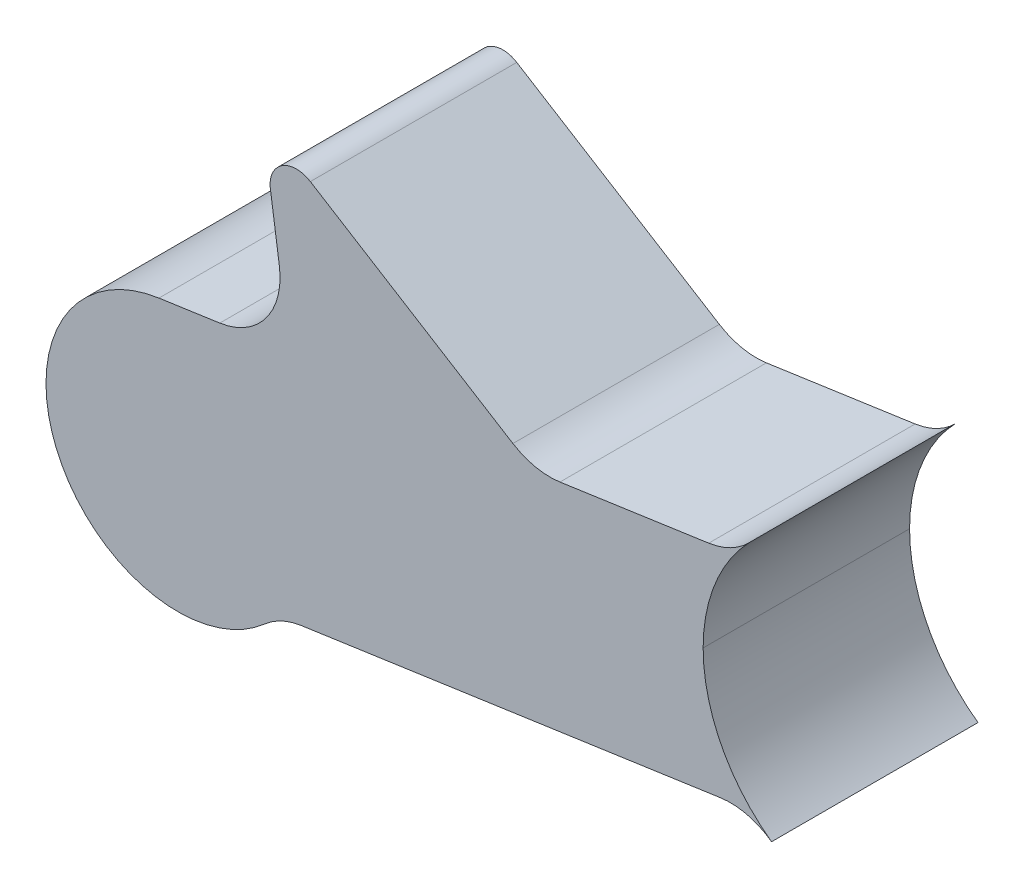
ISO-10303-21;
HEADER;
FILE_DESCRIPTION(('STEP AP214'),'2;1');
FILE_NAME('part.step','',(''),(''),'','','');
FILE_SCHEMA(('AUTOMOTIVE_DESIGN { 1 0 10303 214 1 1 1 1 }'));
ENDSEC;
DATA;
#1=APPLICATION_CONTEXT('core data for automotive mechanical design processes');
#2=APPLICATION_PROTOCOL_DEFINITION('international standard','automotive_design',2000,#1);
#3=PRODUCT_CONTEXT('',#1,'mechanical');
#4=PRODUCT('Part','Part','',(#3));
#5=PRODUCT_RELATED_PRODUCT_CATEGORY('part','',(#4));
#6=PRODUCT_DEFINITION_FORMATION('','',#4);
#7=PRODUCT_DEFINITION_CONTEXT('part definition',#1,'design');
#8=PRODUCT_DEFINITION('design','',#6,#7);
#9=PRODUCT_DEFINITION_SHAPE('','',#8);
#10=(LENGTH_UNIT() NAMED_UNIT(*) SI_UNIT(.MILLI.,.METRE.));
#11=(NAMED_UNIT(*) PLANE_ANGLE_UNIT() SI_UNIT($,.RADIAN.));
#12=(NAMED_UNIT(*) SI_UNIT($,.STERADIAN.) SOLID_ANGLE_UNIT());
#13=UNCERTAINTY_MEASURE_WITH_UNIT(LENGTH_MEASURE(1.E-05),#10,'distance_accuracy_value','');
#14=(GEOMETRIC_REPRESENTATION_CONTEXT(3) GLOBAL_UNCERTAINTY_ASSIGNED_CONTEXT((#13)) GLOBAL_UNIT_ASSIGNED_CONTEXT((#10,
#11,#12)) REPRESENTATION_CONTEXT('',''));
#15=CARTESIAN_POINT('',(0.,0.,0.));
#16=DIRECTION('',(0.,0.,1.));
#17=DIRECTION('',(1.,0.,0.));
#18=AXIS2_PLACEMENT_3D('',#15,#16,#17);
#19=CARTESIAN_POINT('',(30.6011444259713,54.9045162696453,4.7));
#20=DIRECTION('',(0.,0.,-1.));
#21=DIRECTION('',(0.,-1.,0.));
#22=AXIS2_PLACEMENT_3D('',#19,#20,#21);
#23=PLANE('',#22);
#24=CARTESIAN_POINT('',(-36.8555737068738,46.2228047811088,4.7));
#25=DIRECTION('',(0.,0.,-1.));
#26=DIRECTION('',(1.,0.,0.));
#27=AXIS2_PLACEMENT_3D('',#24,#25,#26);
#28=CIRCLE('',#27,3.19999999999991);
#29=CARTESIAN_POINT('',(-37.3123653382945,49.3900340758495,4.7));
#30=VERTEX_POINT('',#29);
#31=CARTESIAN_POINT('',(-34.9850901835967,48.8192044786031,4.7));
#32=VERTEX_POINT('',#31);
#33=EDGE_CURVE('E38',#30,#32,#28,.T.);
#34=ORIENTED_EDGE('',*,*,#33,.T.);
#35=CARTESIAN_POINT('',(-30.6011444259716,54.9045162696453,4.7));
#36=DIRECTION('',(0.,0.,-1.));
#37=DIRECTION('',(1.,0.,0.));
#38=AXIS2_PLACEMENT_3D('',#35,#36,#37);
#39=CIRCLE('',#38,7.49999999999992);
#40=CARTESIAN_POINT('',(-38.1011444259714,54.9045162696453,4.7));
#41=VERTEX_POINT('',#40);
#42=EDGE_CURVE('E183',#32,#41,#39,.T.);
#43=ORIENTED_EDGE('',*,*,#42,.T.);
#44=CARTESIAN_POINT('',(-30.6011444259716,54.9045162696453,4.7));
#45=DIRECTION('',(0.,0.,-1.));
#46=DIRECTION('',(1.,0.,0.));
#47=AXIS2_PLACEMENT_3D('',#44,#45,#46);
#48=CIRCLE('',#47,7.49999999999992);
#49=CARTESIAN_POINT('',(-36.00051382558,60.1099759118452,4.7));
#50=VERTEX_POINT('',#49);
#51=EDGE_CURVE('E11',#41,#50,#48,.T.);
#52=ORIENTED_EDGE('',*,*,#51,.T.);
#53=CARTESIAN_POINT('',(-38.3042447694158,62.3309720258474,4.7));
#54=DIRECTION('',(0.,0.,-1.));
#55=DIRECTION('',(1.,0.,0.));
#56=AXIS2_PLACEMENT_3D('',#53,#54,#55);
#57=CIRCLE('',#56,3.2);
#58=CARTESIAN_POINT('',(-37.847453137995,59.1637427311067,4.7));
#59=VERTEX_POINT('',#58);
#60=EDGE_CURVE('E215',#50,#59,#57,.T.);
#61=ORIENTED_EDGE('',*,*,#60,.T.);
#62=DIRECTION('',(-0.989759154606485,-0.142747384818972,0.));
#63=VECTOR('',#62,1.);
#64=CARTESIAN_POINT('',(-44.6212712762845,58.1867931166678,4.7));
#65=LINE('',#64,#63);
#66=CARTESIAN_POINT('',(-44.6212712762845,58.1867931166678,4.7));
#67=VERTEX_POINT('',#66);
#68=EDGE_CURVE('E277',#59,#67,#65,.T.);
#69=ORIENTED_EDGE('',*,*,#68,.T.);
#70=CARTESIAN_POINT('',(-45.0780629077053,61.3540224114086,4.7));
#71=DIRECTION('',(0.,0.,-1.));
#72=DIRECTION('',(1.,0.,0.));
#73=AXIS2_PLACEMENT_3D('',#70,#71,#72);
#74=CIRCLE('',#73,3.19999999999996);
#75=CARTESIAN_POINT('',(-46.7639959644878,58.6341640092031,4.7));
#76=VERTEX_POINT('',#75);
#77=EDGE_CURVE('E286',#67,#76,#74,.T.);
#78=ORIENTED_EDGE('',*,*,#77,.T.);
#79=DIRECTION('',(-0.849955750689228,0.526854080244531,0.));
#80=VECTOR('',#79,1.);
#81=CARTESIAN_POINT('',(-55.9883901017896,64.3520024791238,4.7));
#82=LINE('',#81,#80);
#83=CARTESIAN_POINT('',(-55.9883901017896,64.3520024791238,4.7));
#84=VERTEX_POINT('',#83);
#85=EDGE_CURVE('E302',#76,#84,#82,.T.);
#86=ORIENTED_EDGE('',*,*,#85,.T.);
#87=CARTESIAN_POINT('',(-56.6206149980831,63.3320555782967,4.7));
#88=DIRECTION('',(0.,0.,1.));
#89=DIRECTION('',(1.,0.,0.));
#90=AXIS2_PLACEMENT_3D('',#87,#88,#89);
#91=CIRCLE('',#90,1.20000000000001);
#92=CARTESIAN_POINT('',(-57.8206149980831,63.3320555782967,4.7));
#93=VERTEX_POINT('',#92);
#94=EDGE_CURVE('E229',#84,#93,#91,.T.);
#95=ORIENTED_EDGE('',*,*,#94,.T.);
#96=CARTESIAN_POINT('',(-56.6206149980831,63.3320555782967,4.7));
#97=DIRECTION('',(0.,0.,1.));
#98=DIRECTION('',(1.,0.,0.));
#99=AXIS2_PLACEMENT_3D('',#96,#97,#98);
#100=CIRCLE('',#99,1.20000000000001);
#101=CARTESIAN_POINT('',(-57.8083259836109,63.1607587165139,4.7));
#102=VERTEX_POINT('',#101);
#103=EDGE_CURVE('E202',#93,#102,#100,.T.);
#104=ORIENTED_EDGE('',*,*,#103,.T.);
#105=DIRECTION('',(0.142747384818987,-0.989759154606483,0.));
#106=VECTOR('',#105,1.);
#107=CARTESIAN_POINT('',(-57.4007185974163,60.3345553329433,4.7));
#108=LINE('',#107,#106);
#109=CARTESIAN_POINT('',(-57.4007185974163,60.3345553329433,4.7));
#110=VERTEX_POINT('',#109);
#111=EDGE_CURVE('E209',#102,#110,#108,.T.);
#112=ORIENTED_EDGE('',*,*,#111,.T.);
#113=CARTESIAN_POINT('',(-60.5679478921571,59.8777637015226,4.7));
#114=DIRECTION('',(0.,0.,-1.));
#115=DIRECTION('',(1.,0.,0.));
#116=AXIS2_PLACEMENT_3D('',#113,#114,#115);
#117=CIRCLE('',#116,3.2);
#118=CARTESIAN_POINT('',(-60.1111562607363,56.7105344067818,4.7));
#119=VERTEX_POINT('',#118);
#120=EDGE_CURVE('E313',#110,#119,#117,.T.);
#121=ORIENTED_EDGE('',*,*,#120,.T.);
#122=DIRECTION('',(-0.989759154606485,-0.142747384818971,0.));
#123=VECTOR('',#122,1.);
#124=CARTESIAN_POINT('',(-62.8824818936345,56.3108417292887,4.7));
#125=LINE('',#124,#123);
#126=CARTESIAN_POINT('',(-62.8824818936345,56.3108417292887,4.7));
#127=VERTEX_POINT('',#126);
#128=EDGE_CURVE('E299',#119,#127,#125,.T.);
#129=ORIENTED_EDGE('',*,*,#128,.T.);
#130=CARTESIAN_POINT('',(-62.0259975845988,50.3722868016673,4.7));
#131=DIRECTION('',(0.,0.,1.));
#132=DIRECTION('',(1.,0.,0.));
#133=AXIS2_PLACEMENT_3D('',#130,#131,#132);
#134=CIRCLE('',#133,6.);
#135=CARTESIAN_POINT('',(-68.0259975845988,50.3722868016673,4.7));
#136=VERTEX_POINT('',#135);
#137=EDGE_CURVE('E221',#127,#136,#134,.T.);
#138=ORIENTED_EDGE('',*,*,#137,.T.);
#139=CARTESIAN_POINT('',(-62.0259975845988,50.3722868016673,4.7));
#140=DIRECTION('',(0.,0.,1.));
#141=DIRECTION('',(1.,0.,0.));
#142=AXIS2_PLACEMENT_3D('',#139,#140,#141);
#143=CIRCLE('',#142,6.);
#144=CARTESIAN_POINT('',(-58.0591681483125,45.8707021669622,4.7));
#145=VERTEX_POINT('',#144);
#146=EDGE_CURVE('E337',#136,#145,#143,.T.);
#147=ORIENTED_EDGE('',*,*,#146,.T.);
#148=CARTESIAN_POINT('',(-55.9435257822543,43.4698570284872,4.7));
#149=DIRECTION('',(0.,0.,-1.));
#150=DIRECTION('',(1.,0.,0.));
#151=AXIS2_PLACEMENT_3D('',#148,#149,#150);
#152=CIRCLE('',#151,3.19999999999993);
#153=CARTESIAN_POINT('',(-56.400317413675,46.6370863232279,4.7));
#154=VERTEX_POINT('',#153);
#155=EDGE_CURVE('E251',#145,#154,#152,.T.);
#156=ORIENTED_EDGE('',*,*,#155,.T.);
#157=DIRECTION('',(0.989759154606484,0.142747384818981,0.));
#158=VECTOR('',#157,1.);
#159=CARTESIAN_POINT('',(-37.3123653382945,49.3900340758495,4.7));
#160=LINE('',#159,#158);
#161=EDGE_CURVE('E175',#154,#30,#160,.T.);
#162=ORIENTED_EDGE('',*,*,#161,.T.);
#163=EDGE_LOOP('',(#34,#43,#52,#61,#69,#78,#86,#95,#104,#112,#121,#129,#138,#147,#156,#162));
#164=FACE_BOUND('',#163,.T.);
#165=ADVANCED_FACE('F17',(#164),#23,.F.);
#166=CARTESIAN_POINT('',(-31.4999999996571,43.1601366996606,-4.7));
#167=DIRECTION('',(0.,0.,1.));
#168=DIRECTION('',(0.,-1.,0.));
#169=AXIS2_PLACEMENT_3D('',#166,#167,#168);
#170=PLANE('',#169);
#171=CARTESIAN_POINT('',(-38.3042447694158,62.3309720258474,-4.7));
#172=DIRECTION('',(0.,0.,-1.));
#173=DIRECTION('',(0.,-1.,0.));
#174=AXIS2_PLACEMENT_3D('',#171,#172,#173);
#175=CIRCLE('',#174,3.2);
#176=CARTESIAN_POINT('',(-36.00051382558,60.1099759118452,-4.7));
#177=VERTEX_POINT('',#176);
#178=CARTESIAN_POINT('',(-37.847453137995,59.1637427311067,-4.7));
#179=VERTEX_POINT('',#178);
#180=EDGE_CURVE('E228',#177,#179,#175,.T.);
#181=ORIENTED_EDGE('',*,*,#180,.F.);
#182=CARTESIAN_POINT('',(-30.6011444259716,54.9045162696453,-4.7));
#183=DIRECTION('',(0.,0.,-1.));
#184=DIRECTION('',(0.,-1.,0.));
#185=AXIS2_PLACEMENT_3D('',#182,#183,#184);
#186=CIRCLE('',#185,7.49999999999992);
#187=CARTESIAN_POINT('',(-38.1011444259714,54.9045162696453,-4.7));
#188=VERTEX_POINT('',#187);
#189=EDGE_CURVE('E25',#188,#177,#186,.T.);
#190=ORIENTED_EDGE('',*,*,#189,.F.);
#191=CARTESIAN_POINT('',(-30.6011444259716,54.9045162696453,-4.7));
#192=DIRECTION('',(0.,0.,-1.));
#193=DIRECTION('',(0.,-1.,0.));
#194=AXIS2_PLACEMENT_3D('',#191,#192,#193);
#195=CIRCLE('',#194,7.49999999999992);
#196=CARTESIAN_POINT('',(-34.9850901835967,48.8192044786031,-4.7));
#197=VERTEX_POINT('',#196);
#198=EDGE_CURVE('E181',#197,#188,#195,.T.);
#199=ORIENTED_EDGE('',*,*,#198,.F.);
#200=CARTESIAN_POINT('',(-36.8555737068738,46.2228047811088,-4.7));
#201=DIRECTION('',(0.,0.,-1.));
#202=DIRECTION('',(0.,-1.,0.));
#203=AXIS2_PLACEMENT_3D('',#200,#201,#202);
#204=CIRCLE('',#203,3.19999999999991);
#205=CARTESIAN_POINT('',(-37.3123653382945,49.3900340758495,-4.7));
#206=VERTEX_POINT('',#205);
#207=EDGE_CURVE('E49',#206,#197,#204,.T.);
#208=ORIENTED_EDGE('',*,*,#207,.F.);
#209=DIRECTION('',(0.989759154606484,0.142747384818981,0.));
#210=VECTOR('',#209,1.);
#211=CARTESIAN_POINT('',(-37.3123653382945,49.3900340758495,-4.7));
#212=LINE('',#211,#210);
#213=CARTESIAN_POINT('',(-56.400317413675,46.6370863232279,-4.7));
#214=VERTEX_POINT('',#213);
#215=EDGE_CURVE('E255',#214,#206,#212,.T.);
#216=ORIENTED_EDGE('',*,*,#215,.F.);
#217=CARTESIAN_POINT('',(-55.9435257822543,43.4698570284872,-4.7));
#218=DIRECTION('',(0.,0.,-1.));
#219=DIRECTION('',(0.,-1.,0.));
#220=AXIS2_PLACEMENT_3D('',#217,#218,#219);
#221=CIRCLE('',#220,3.19999999999993);
#222=CARTESIAN_POINT('',(-58.0591681483125,45.8707021669622,-4.7));
#223=VERTEX_POINT('',#222);
#224=EDGE_CURVE('E341',#223,#214,#221,.T.);
#225=ORIENTED_EDGE('',*,*,#224,.F.);
#226=CARTESIAN_POINT('',(-62.0259975845988,50.3722868016673,-4.7));
#227=DIRECTION('',(0.,0.,1.));
#228=DIRECTION('',(0.,-1.,0.));
#229=AXIS2_PLACEMENT_3D('',#226,#227,#228);
#230=CIRCLE('',#229,6.);
#231=CARTESIAN_POINT('',(-68.0259975845988,50.3722868016673,-4.7));
#232=VERTEX_POINT('',#231);
#233=EDGE_CURVE('E294',#232,#223,#230,.T.);
#234=ORIENTED_EDGE('',*,*,#233,.F.);
#235=CARTESIAN_POINT('',(-62.0259975845988,50.3722868016673,-4.7));
#236=DIRECTION('',(0.,0.,1.));
#237=DIRECTION('',(0.,-1.,0.));
#238=AXIS2_PLACEMENT_3D('',#235,#236,#237);
#239=CIRCLE('',#238,6.);
#240=CARTESIAN_POINT('',(-62.8824818936345,56.3108417292887,-4.7));
#241=VERTEX_POINT('',#240);
#242=EDGE_CURVE('E185',#241,#232,#239,.T.);
#243=ORIENTED_EDGE('',*,*,#242,.F.);
#244=DIRECTION('',(-0.989759154606485,-0.142747384818971,0.));
#245=VECTOR('',#244,1.);
#246=CARTESIAN_POINT('',(-62.8824818936345,56.3108417292887,-4.7));
#247=LINE('',#246,#245);
#248=CARTESIAN_POINT('',(-60.1111562607363,56.7105344067818,-4.7));
#249=VERTEX_POINT('',#248);
#250=EDGE_CURVE('E310',#249,#241,#247,.T.);
#251=ORIENTED_EDGE('',*,*,#250,.F.);
#252=CARTESIAN_POINT('',(-60.5679478921571,59.8777637015226,-4.7));
#253=DIRECTION('',(0.,0.,-1.));
#254=DIRECTION('',(0.,-1.,0.));
#255=AXIS2_PLACEMENT_3D('',#252,#253,#254);
#256=CIRCLE('',#255,3.2);
#257=CARTESIAN_POINT('',(-57.4007185974163,60.3345553329433,-4.7));
#258=VERTEX_POINT('',#257);
#259=EDGE_CURVE('E204',#258,#249,#256,.T.);
#260=ORIENTED_EDGE('',*,*,#259,.F.);
#261=DIRECTION('',(0.142747384818987,-0.989759154606483,0.));
#262=VECTOR('',#261,1.);
#263=CARTESIAN_POINT('',(-57.4007185974163,60.3345553329433,-4.7));
#264=LINE('',#263,#262);
#265=CARTESIAN_POINT('',(-57.8083259836109,63.1607587165139,-4.7));
#266=VERTEX_POINT('',#265);
#267=EDGE_CURVE('E199',#266,#258,#264,.T.);
#268=ORIENTED_EDGE('',*,*,#267,.F.);
#269=CARTESIAN_POINT('',(-56.6206149980831,63.3320555782967,-4.7));
#270=DIRECTION('',(0.,0.,1.));
#271=DIRECTION('',(0.,-1.,0.));
#272=AXIS2_PLACEMENT_3D('',#269,#270,#271);
#273=CIRCLE('',#272,1.20000000000001);
#274=CARTESIAN_POINT('',(-57.8206149980831,63.3320555782967,-4.7));
#275=VERTEX_POINT('',#274);
#276=EDGE_CURVE('E305',#275,#266,#273,.T.);
#277=ORIENTED_EDGE('',*,*,#276,.F.);
#278=CARTESIAN_POINT('',(-56.6206149980831,63.3320555782967,-4.7));
#279=DIRECTION('',(0.,0.,1.));
#280=DIRECTION('',(0.,-1.,0.));
#281=AXIS2_PLACEMENT_3D('',#278,#279,#280);
#282=CIRCLE('',#281,1.20000000000001);
#283=CARTESIAN_POINT('',(-55.9883901017896,64.3520024791238,-4.7));
#284=VERTEX_POINT('',#283);
#285=EDGE_CURVE('E220',#284,#275,#282,.T.);
#286=ORIENTED_EDGE('',*,*,#285,.F.);
#287=DIRECTION('',(-0.849955750689228,0.526854080244531,0.));
#288=VECTOR('',#287,1.);
#289=CARTESIAN_POINT('',(-55.9883901017896,64.3520024791238,-4.7));
#290=LINE('',#289,#288);
#291=CARTESIAN_POINT('',(-46.7639959644878,58.6341640092031,-4.7));
#292=VERTEX_POINT('',#291);
#293=EDGE_CURVE('E290',#292,#284,#290,.T.);
#294=ORIENTED_EDGE('',*,*,#293,.F.);
#295=CARTESIAN_POINT('',(-45.0780629077053,61.3540224114086,-4.7));
#296=DIRECTION('',(0.,0.,-1.));
#297=DIRECTION('',(0.,-1.,0.));
#298=AXIS2_PLACEMENT_3D('',#295,#296,#297);
#299=CIRCLE('',#298,3.19999999999996);
#300=CARTESIAN_POINT('',(-44.6212712762845,58.1867931166678,-4.7));
#301=VERTEX_POINT('',#300);
#302=EDGE_CURVE('E281',#301,#292,#299,.T.);
#303=ORIENTED_EDGE('',*,*,#302,.F.);
#304=DIRECTION('',(-0.989759154606485,-0.142747384818972,0.));
#305=VECTOR('',#304,1.);
#306=CARTESIAN_POINT('',(-44.6212712762845,58.1867931166678,-4.7));
#307=LINE('',#306,#305);
#308=EDGE_CURVE('E214',#179,#301,#307,.T.);
#309=ORIENTED_EDGE('',*,*,#308,.F.);
#310=EDGE_LOOP('',(#181,#190,#199,#208,#216,#225,#234,#243,#251,#260,#268,#277,#286,#294,#303,#309));
#311=FACE_BOUND('',#310,.T.);
#312=ADVANCED_FACE('F188',(#311),#170,.F.);
#313=CARTESIAN_POINT('',(-30.6011444259716,54.9045162696453,-43.405527241064));
#314=DIRECTION('',(0.,0.,1.));
#315=DIRECTION('',(-1.,0.,0.));
#316=AXIS2_PLACEMENT_3D('',#313,#314,#315);
#317=CYLINDRICAL_SURFACE('',#316,7.49999999999992);
#318=DIRECTION('',(0.,0.,1.));
#319=VECTOR('',#318,1.);
#320=CARTESIAN_POINT('',(-38.1011444259714,54.9045162696453,-43.405527241064));
#321=LINE('',#320,#319);
#322=EDGE_CURVE('E191',#188,#41,#321,.T.);
#323=ORIENTED_EDGE('',*,*,#322,.F.);
#324=ORIENTED_EDGE('',*,*,#189,.T.);
#325=DIRECTION('',(0.,0.,1.));
#326=VECTOR('',#325,1.);
#327=CARTESIAN_POINT('',(-36.00051382558,60.1099759118452,-43.405527241064));
#328=LINE('',#327,#326);
#329=EDGE_CURVE('E210',#177,#50,#328,.T.);
#330=ORIENTED_EDGE('',*,*,#329,.T.);
#331=ORIENTED_EDGE('',*,*,#51,.F.);
#332=EDGE_LOOP('',(#323,#324,#330,#331));
#333=FACE_BOUND('',#332,.T.);
#334=ADVANCED_FACE('F400',(#333),#317,.F.);
#335=CARTESIAN_POINT('',(-36.8555737068738,46.2228047811088,-43.405527241064));
#336=DIRECTION('',(0.,0.,1.));
#337=DIRECTION('',(-1.,0.,0.));
#338=AXIS2_PLACEMENT_3D('',#335,#336,#337);
#339=CYLINDRICAL_SURFACE('',#338,3.19999999999991);
#340=ORIENTED_EDGE('',*,*,#207,.T.);
#341=DIRECTION('',(0.,0.,1.));
#342=VECTOR('',#341,1.);
#343=CARTESIAN_POINT('',(-34.9850901835967,48.8192044786031,-43.405527241064));
#344=LINE('',#343,#342);
#345=EDGE_CURVE('E169',#197,#32,#344,.T.);
#346=ORIENTED_EDGE('',*,*,#345,.T.);
#347=ORIENTED_EDGE('',*,*,#33,.F.);
#348=DIRECTION('',(0.,0.,1.));
#349=VECTOR('',#348,1.);
#350=CARTESIAN_POINT('',(-37.3123653382945,49.3900340758495,-43.405527241064));
#351=LINE('',#350,#349);
#352=EDGE_CURVE('E172',#206,#30,#351,.T.);
#353=ORIENTED_EDGE('',*,*,#352,.F.);
#354=EDGE_LOOP('',(#340,#346,#347,#353));
#355=FACE_BOUND('',#354,.T.);
#356=ADVANCED_FACE('F168',(#355),#339,.F.);
#357=CARTESIAN_POINT('',(-37.3123653382945,49.3900340758495,-43.405527241064));
#358=DIRECTION('',(0.142747384818981,-0.989759154606484,0.));
#359=DIRECTION('',(0.,0.,-1.));
#360=AXIS2_PLACEMENT_3D('',#357,#358,#359);
#361=PLANE('',#360);
#362=ORIENTED_EDGE('',*,*,#215,.T.);
#363=ORIENTED_EDGE('',*,*,#352,.T.);
#364=ORIENTED_EDGE('',*,*,#161,.F.);
#365=DIRECTION('',(0.,0.,1.));
#366=VECTOR('',#365,1.);
#367=CARTESIAN_POINT('',(-56.400317413675,46.6370863232279,-43.405527241064));
#368=LINE('',#367,#366);
#369=EDGE_CURVE('E256',#214,#154,#368,.T.);
#370=ORIENTED_EDGE('',*,*,#369,.F.);
#371=EDGE_LOOP('',(#362,#363,#364,#370));
#372=FACE_BOUND('',#371,.T.);
#373=ADVANCED_FACE('F357',(#372),#361,.T.);
#374=CARTESIAN_POINT('',(-55.9435257822543,43.4698570284872,-43.405527241064));
#375=DIRECTION('',(0.,0.,1.));
#376=DIRECTION('',(-1.,0.,0.));
#377=AXIS2_PLACEMENT_3D('',#374,#375,#376);
#378=CYLINDRICAL_SURFACE('',#377,3.19999999999993);
#379=ORIENTED_EDGE('',*,*,#224,.T.);
#380=ORIENTED_EDGE('',*,*,#369,.T.);
#381=ORIENTED_EDGE('',*,*,#155,.F.);
#382=DIRECTION('',(0.,0.,1.));
#383=VECTOR('',#382,1.);
#384=CARTESIAN_POINT('',(-58.0591681483125,45.8707021669622,-43.405527241064));
#385=LINE('',#384,#383);
#386=EDGE_CURVE('E298',#223,#145,#385,.T.);
#387=ORIENTED_EDGE('',*,*,#386,.F.);
#388=EDGE_LOOP('',(#379,#380,#381,#387));
#389=FACE_BOUND('',#388,.T.);
#390=ADVANCED_FACE('F362',(#389),#378,.F.);
#391=CARTESIAN_POINT('',(-62.0259975845988,50.3722868016673,-43.405527241064));
#392=DIRECTION('',(0.,0.,1.));
#393=DIRECTION('',(-1.,0.,0.));
#394=AXIS2_PLACEMENT_3D('',#391,#392,#393);
#395=CYLINDRICAL_SURFACE('',#394,6.);
#396=DIRECTION('',(0.,0.,1.));
#397=VECTOR('',#396,1.);
#398=CARTESIAN_POINT('',(-68.0259975845988,50.3722868016673,-43.405527241064));
#399=LINE('',#398,#397);
#400=EDGE_CURVE('E236',#232,#136,#399,.T.);
#401=ORIENTED_EDGE('',*,*,#400,.F.);
#402=ORIENTED_EDGE('',*,*,#233,.T.);
#403=ORIENTED_EDGE('',*,*,#386,.T.);
#404=ORIENTED_EDGE('',*,*,#146,.F.);
#405=EDGE_LOOP('',(#401,#402,#403,#404));
#406=FACE_BOUND('',#405,.T.);
#407=ADVANCED_FACE('F364',(#406),#395,.T.);
#408=CARTESIAN_POINT('',(-62.8824818936345,56.3108417292887,-43.405527241064));
#409=DIRECTION('',(-0.142747384818971,0.989759154606485,0.));
#410=DIRECTION('',(0.,0.,1.));
#411=AXIS2_PLACEMENT_3D('',#408,#409,#410);
#412=PLANE('',#411);
#413=ORIENTED_EDGE('',*,*,#250,.T.);
#414=DIRECTION('',(0.,0.,1.));
#415=VECTOR('',#414,1.);
#416=CARTESIAN_POINT('',(-62.8824818936345,56.3108417292887,-43.405527241064));
#417=LINE('',#416,#415);
#418=EDGE_CURVE('E216',#241,#127,#417,.T.);
#419=ORIENTED_EDGE('',*,*,#418,.T.);
#420=ORIENTED_EDGE('',*,*,#128,.F.);
#421=DIRECTION('',(0.,0.,1.));
#422=VECTOR('',#421,1.);
#423=CARTESIAN_POINT('',(-60.1111562607363,56.7105344067818,-43.405527241064));
#424=LINE('',#423,#422);
#425=EDGE_CURVE('E208',#249,#119,#424,.T.);
#426=ORIENTED_EDGE('',*,*,#425,.F.);
#427=EDGE_LOOP('',(#413,#419,#420,#426));
#428=FACE_BOUND('',#427,.T.);
#429=ADVANCED_FACE('F372',(#428),#412,.T.);
#430=CARTESIAN_POINT('',(-60.5679478921571,59.8777637015226,-43.405527241064));
#431=DIRECTION('',(0.,0.,1.));
#432=DIRECTION('',(-1.,0.,0.));
#433=AXIS2_PLACEMENT_3D('',#430,#431,#432);
#434=CYLINDRICAL_SURFACE('',#433,3.2);
#435=ORIENTED_EDGE('',*,*,#259,.T.);
#436=ORIENTED_EDGE('',*,*,#425,.T.);
#437=ORIENTED_EDGE('',*,*,#120,.F.);
#438=DIRECTION('',(0.,0.,1.));
#439=VECTOR('',#438,1.);
#440=CARTESIAN_POINT('',(-57.4007185974163,60.3345553329433,-43.405527241064));
#441=LINE('',#440,#439);
#442=EDGE_CURVE('E201',#258,#110,#441,.T.);
#443=ORIENTED_EDGE('',*,*,#442,.F.);
#444=EDGE_LOOP('',(#435,#436,#437,#443));
#445=FACE_BOUND('',#444,.T.);
#446=ADVANCED_FACE('F374',(#445),#434,.F.);
#447=CARTESIAN_POINT('',(-57.4007185974163,60.3345553329433,-43.405527241064));
#448=DIRECTION('',(-0.989759154606483,-0.142747384818987,0.));
#449=DIRECTION('',(-0.142747384818987,0.989759154606483,0.));
#450=AXIS2_PLACEMENT_3D('',#447,#448,#449);
#451=PLANE('',#450);
#452=ORIENTED_EDGE('',*,*,#267,.T.);
#453=ORIENTED_EDGE('',*,*,#442,.T.);
#454=ORIENTED_EDGE('',*,*,#111,.F.);
#455=DIRECTION('',(0.,0.,1.));
#456=VECTOR('',#455,1.);
#457=CARTESIAN_POINT('',(-57.8083259836109,63.1607587165139,-43.405527241064));
#458=LINE('',#457,#456);
#459=EDGE_CURVE('E309',#266,#102,#458,.T.);
#460=ORIENTED_EDGE('',*,*,#459,.F.);
#461=EDGE_LOOP('',(#452,#453,#454,#460));
#462=FACE_BOUND('',#461,.T.);
#463=ADVANCED_FACE('F377',(#462),#451,.T.);
#464=CARTESIAN_POINT('',(-56.6206149980831,63.3320555782967,-43.405527241064));
#465=DIRECTION('',(0.,0.,1.));
#466=DIRECTION('',(-1.,0.,0.));
#467=AXIS2_PLACEMENT_3D('',#464,#465,#466);
#468=CYLINDRICAL_SURFACE('',#467,1.20000000000001);
#469=DIRECTION('',(0.,0.,1.));
#470=VECTOR('',#469,1.);
#471=CARTESIAN_POINT('',(-57.8206149980831,63.3320555782967,-43.405527241064));
#472=LINE('',#471,#470);
#473=EDGE_CURVE('E263',#275,#93,#472,.T.);
#474=ORIENTED_EDGE('',*,*,#473,.F.);
#475=ORIENTED_EDGE('',*,*,#276,.T.);
#476=ORIENTED_EDGE('',*,*,#459,.T.);
#477=ORIENTED_EDGE('',*,*,#103,.F.);
#478=EDGE_LOOP('',(#474,#475,#476,#477));
#479=FACE_BOUND('',#478,.T.);
#480=ADVANCED_FACE('F381',(#479),#468,.T.);
#481=CARTESIAN_POINT('',(-55.9883901017896,64.3520024791238,-43.405527241064));
#482=DIRECTION('',(0.526854080244531,0.849955750689228,0.));
#483=DIRECTION('',(0.,0.,-1.));
#484=AXIS2_PLACEMENT_3D('',#481,#482,#483);
#485=PLANE('',#484);
#486=ORIENTED_EDGE('',*,*,#293,.T.);
#487=DIRECTION('',(0.,0.,1.));
#488=VECTOR('',#487,1.);
#489=CARTESIAN_POINT('',(-55.9883901017896,64.3520024791238,-43.405527241064));
#490=LINE('',#489,#488);
#491=EDGE_CURVE('E224',#284,#84,#490,.T.);
#492=ORIENTED_EDGE('',*,*,#491,.T.);
#493=ORIENTED_EDGE('',*,*,#85,.F.);
#494=DIRECTION('',(0.,0.,1.));
#495=VECTOR('',#494,1.);
#496=CARTESIAN_POINT('',(-46.7639959644878,58.6341640092031,-43.405527241064));
#497=LINE('',#496,#495);
#498=EDGE_CURVE('E285',#292,#76,#497,.T.);
#499=ORIENTED_EDGE('',*,*,#498,.F.);
#500=EDGE_LOOP('',(#486,#492,#493,#499));
#501=FACE_BOUND('',#500,.T.);
#502=ADVANCED_FACE('F387',(#501),#485,.T.);
#503=CARTESIAN_POINT('',(-45.0780629077053,61.3540224114086,-43.405527241064));
#504=DIRECTION('',(0.,0.,1.));
#505=DIRECTION('',(-1.,0.,0.));
#506=AXIS2_PLACEMENT_3D('',#503,#504,#505);
#507=CYLINDRICAL_SURFACE('',#506,3.19999999999996);
#508=ORIENTED_EDGE('',*,*,#302,.T.);
#509=ORIENTED_EDGE('',*,*,#498,.T.);
#510=ORIENTED_EDGE('',*,*,#77,.F.);
#511=DIRECTION('',(0.,0.,1.));
#512=VECTOR('',#511,1.);
#513=CARTESIAN_POINT('',(-44.6212712762845,58.1867931166678,-43.405527241064));
#514=LINE('',#513,#512);
#515=EDGE_CURVE('E273',#301,#67,#514,.T.);
#516=ORIENTED_EDGE('',*,*,#515,.F.);
#517=EDGE_LOOP('',(#508,#509,#510,#516));
#518=FACE_BOUND('',#517,.T.);
#519=ADVANCED_FACE('F392',(#518),#507,.F.);
#520=CARTESIAN_POINT('',(-44.6212712762845,58.1867931166678,-43.405527241064));
#521=DIRECTION('',(-0.142747384818972,0.989759154606485,0.));
#522=DIRECTION('',(0.,0.,1.));
#523=AXIS2_PLACEMENT_3D('',#520,#521,#522);
#524=PLANE('',#523);
#525=ORIENTED_EDGE('',*,*,#308,.T.);
#526=ORIENTED_EDGE('',*,*,#515,.T.);
#527=ORIENTED_EDGE('',*,*,#68,.F.);
#528=DIRECTION('',(0.,0.,1.));
#529=VECTOR('',#528,1.);
#530=CARTESIAN_POINT('',(-37.847453137995,59.1637427311067,-43.405527241064));
#531=LINE('',#530,#529);
#532=EDGE_CURVE('E235',#179,#59,#531,.T.);
#533=ORIENTED_EDGE('',*,*,#532,.F.);
#534=EDGE_LOOP('',(#525,#526,#527,#533));
#535=FACE_BOUND('',#534,.T.);
#536=ADVANCED_FACE('F394',(#535),#524,.T.);
#537=CARTESIAN_POINT('',(-38.3042447694158,62.3309720258474,-43.405527241064));
#538=DIRECTION('',(0.,0.,1.));
#539=DIRECTION('',(-1.,0.,0.));
#540=AXIS2_PLACEMENT_3D('',#537,#538,#539);
#541=CYLINDRICAL_SURFACE('',#540,3.2);
#542=ORIENTED_EDGE('',*,*,#180,.T.);
#543=ORIENTED_EDGE('',*,*,#532,.T.);
#544=ORIENTED_EDGE('',*,*,#60,.F.);
#545=ORIENTED_EDGE('',*,*,#329,.F.);
#546=EDGE_LOOP('',(#542,#543,#544,#545));
#547=FACE_BOUND('',#546,.T.);
#548=ADVANCED_FACE('F398',(#547),#541,.F.);
#549=CARTESIAN_POINT('',(-56.6206149980831,63.3320555782967,-43.405527241064));
#550=DIRECTION('',(0.,0.,1.));
#551=DIRECTION('',(-1.,0.,0.));
#552=AXIS2_PLACEMENT_3D('',#549,#550,#551);
#553=CYLINDRICAL_SURFACE('',#552,1.20000000000001);
#554=ORIENTED_EDGE('',*,*,#285,.T.);
#555=ORIENTED_EDGE('',*,*,#473,.T.);
#556=ORIENTED_EDGE('',*,*,#94,.F.);
#557=ORIENTED_EDGE('',*,*,#491,.F.);
#558=EDGE_LOOP('',(#554,#555,#556,#557));
#559=FACE_BOUND('',#558,.T.);
#560=ADVANCED_FACE('F385',(#559),#553,.T.);
#561=CARTESIAN_POINT('',(-62.0259975845988,50.3722868016673,-43.405527241064));
#562=DIRECTION('',(0.,0.,1.));
#563=DIRECTION('',(-1.,0.,0.));
#564=AXIS2_PLACEMENT_3D('',#561,#562,#563);
#565=CYLINDRICAL_SURFACE('',#564,6.);
#566=ORIENTED_EDGE('',*,*,#242,.T.);
#567=ORIENTED_EDGE('',*,*,#400,.T.);
#568=ORIENTED_EDGE('',*,*,#137,.F.);
#569=ORIENTED_EDGE('',*,*,#418,.F.);
#570=EDGE_LOOP('',(#566,#567,#568,#569));
#571=FACE_BOUND('',#570,.T.);
#572=ADVANCED_FACE('F368',(#571),#565,.T.);
#573=CARTESIAN_POINT('',(-30.6011444259716,54.9045162696453,-43.405527241064));
#574=DIRECTION('',(0.,0.,1.));
#575=DIRECTION('',(-1.,0.,0.));
#576=AXIS2_PLACEMENT_3D('',#573,#574,#575);
#577=CYLINDRICAL_SURFACE('',#576,7.49999999999992);
#578=ORIENTED_EDGE('',*,*,#198,.T.);
#579=ORIENTED_EDGE('',*,*,#322,.T.);
#580=ORIENTED_EDGE('',*,*,#42,.F.);
#581=ORIENTED_EDGE('',*,*,#345,.F.);
#582=EDGE_LOOP('',(#578,#579,#580,#581));
#583=FACE_BOUND('',#582,.T.);
#584=ADVANCED_FACE('F179',(#583),#577,.F.);
#585=CLOSED_SHELL('',(#165,#312,#334,#356,#373,#390,#407,#429,#446,#463,#480,#502,#519,#536,
#548,#560,#572,#584));
#586=MANIFOLD_SOLID_BREP('B1',#585);
#587=ADVANCED_BREP_SHAPE_REPRESENTATION('',(#18,#586),#14);
#588=SHAPE_DEFINITION_REPRESENTATION(#9,#587);
ENDSEC;
END-ISO-10303-21;
